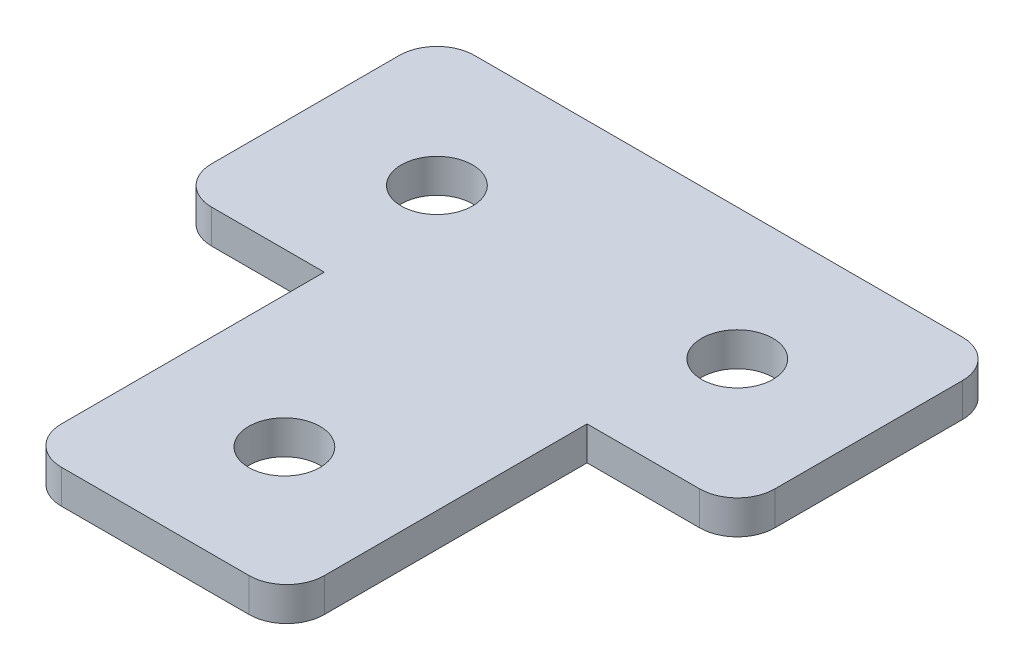
ISO-10303-21;
HEADER;
FILE_DESCRIPTION(('STEP AP214'),'2;1');
FILE_NAME('part.step','',(''),(''),'','','');
FILE_SCHEMA(('AUTOMOTIVE_DESIGN { 1 0 10303 214 1 1 1 1 }'));
ENDSEC;
DATA;
#1=APPLICATION_CONTEXT('core data for automotive mechanical design processes');
#2=APPLICATION_PROTOCOL_DEFINITION('international standard','automotive_design',2000,#1);
#3=PRODUCT_CONTEXT('',#1,'mechanical');
#4=PRODUCT('Part','Part','',(#3));
#5=PRODUCT_RELATED_PRODUCT_CATEGORY('part','',(#4));
#6=PRODUCT_DEFINITION_FORMATION('','',#4);
#7=PRODUCT_DEFINITION_CONTEXT('part definition',#1,'design');
#8=PRODUCT_DEFINITION('design','',#6,#7);
#9=PRODUCT_DEFINITION_SHAPE('','',#8);
#10=(LENGTH_UNIT() NAMED_UNIT(*) SI_UNIT(.MILLI.,.METRE.));
#11=(NAMED_UNIT(*) PLANE_ANGLE_UNIT() SI_UNIT($,.RADIAN.));
#12=(NAMED_UNIT(*) SI_UNIT($,.STERADIAN.) SOLID_ANGLE_UNIT());
#13=UNCERTAINTY_MEASURE_WITH_UNIT(LENGTH_MEASURE(1.E-05),#10,'distance_accuracy_value','');
#14=(GEOMETRIC_REPRESENTATION_CONTEXT(3) GLOBAL_UNCERTAINTY_ASSIGNED_CONTEXT((#13)) GLOBAL_UNIT_ASSIGNED_CONTEXT((#10,
#11,#12)) REPRESENTATION_CONTEXT('',''));
#15=CARTESIAN_POINT('',(0.,0.,0.));
#16=DIRECTION('',(0.,0.,1.));
#17=DIRECTION('',(1.,0.,0.));
#18=AXIS2_PLACEMENT_3D('',#15,#16,#17);
#19=CARTESIAN_POINT('',(0.,1.8,0.));
#20=DIRECTION('',(0.,1.,0.));
#21=DIRECTION('',(0.,0.,1.));
#22=AXIS2_PLACEMENT_3D('',#19,#20,#21);
#23=PLANE('',#22);
#24=CARTESIAN_POINT('',(23.,1.8,7.));
#25=DIRECTION('',(0.,1.,0.));
#26=DIRECTION('',(0.,0.,1.));
#27=AXIS2_PLACEMENT_3D('',#24,#25,#26);
#28=CIRCLE('',#27,1.9);
#29=CARTESIAN_POINT('',(23.,1.8,8.9));
#30=VERTEX_POINT('',#29);
#31=EDGE_CURVE('E336',#30,#30,#28,.T.);
#32=ORIENTED_EDGE('',*,*,#31,.F.);
#33=EDGE_LOOP('',(#32));
#34=FACE_BOUND('',#33,.T.);
#35=DIRECTION('',(-1.,0.,0.));
#36=VECTOR('',#35,1.);
#37=CARTESIAN_POINT('',(0.,1.8,0.));
#38=LINE('',#37,#36);
#39=CARTESIAN_POINT('',(28.,1.8,0.));
#40=VERTEX_POINT('',#39);
#41=CARTESIAN_POINT('',(2.,1.8,0.));
#42=VERTEX_POINT('',#41);
#43=EDGE_CURVE('E177',#40,#42,#38,.T.);
#44=ORIENTED_EDGE('',*,*,#43,.T.);
#45=CARTESIAN_POINT('',(2.,1.8,2.));
#46=DIRECTION('',(0.,1.,0.));
#47=DIRECTION('',(0.,0.,1.));
#48=AXIS2_PLACEMENT_3D('',#45,#46,#47);
#49=CIRCLE('',#48,2.);
#50=CARTESIAN_POINT('',(0.,1.8,2.));
#51=VERTEX_POINT('',#50);
#52=EDGE_CURVE('E230',#42,#51,#49,.T.);
#53=ORIENTED_EDGE('',*,*,#52,.T.);
#54=DIRECTION('',(0.,0.,1.));
#55=VECTOR('',#54,1.);
#56=CARTESIAN_POINT('',(0.,1.8,0.));
#57=LINE('',#56,#55);
#58=CARTESIAN_POINT('',(0.,1.8,12.));
#59=VERTEX_POINT('',#58);
#60=EDGE_CURVE('E150',#51,#59,#57,.T.);
#61=ORIENTED_EDGE('',*,*,#60,.T.);
#62=CARTESIAN_POINT('',(2.,1.8,12.));
#63=DIRECTION('',(0.,1.,0.));
#64=DIRECTION('',(0.,0.,1.));
#65=AXIS2_PLACEMENT_3D('',#62,#63,#64);
#66=CIRCLE('',#65,2.);
#67=CARTESIAN_POINT('',(2.,1.8,14.));
#68=VERTEX_POINT('',#67);
#69=EDGE_CURVE('E146',#59,#68,#66,.T.);
#70=ORIENTED_EDGE('',*,*,#69,.T.);
#71=DIRECTION('',(1.,0.,0.));
#72=VECTOR('',#71,1.);
#73=CARTESIAN_POINT('',(0.,1.8,14.));
#74=LINE('',#73,#72);
#75=CARTESIAN_POINT('',(8.,1.8,14.));
#76=VERTEX_POINT('',#75);
#77=EDGE_CURVE('E137',#68,#76,#74,.T.);
#78=ORIENTED_EDGE('',*,*,#77,.T.);
#79=DIRECTION('',(0.,0.,1.));
#80=VECTOR('',#79,1.);
#81=CARTESIAN_POINT('',(8.,1.8,14.));
#82=LINE('',#81,#80);
#83=CARTESIAN_POINT('',(8.,1.8,28.));
#84=VERTEX_POINT('',#83);
#85=EDGE_CURVE('E142',#76,#84,#82,.T.);
#86=ORIENTED_EDGE('',*,*,#85,.T.);
#87=CARTESIAN_POINT('',(10.,1.8,28.));
#88=DIRECTION('',(0.,1.,0.));
#89=DIRECTION('',(0.,0.,1.));
#90=AXIS2_PLACEMENT_3D('',#87,#88,#89);
#91=CIRCLE('',#90,2.);
#92=CARTESIAN_POINT('',(10.,1.8,30.));
#93=VERTEX_POINT('',#92);
#94=EDGE_CURVE('E224',#84,#93,#91,.T.);
#95=ORIENTED_EDGE('',*,*,#94,.T.);
#96=DIRECTION('',(1.,0.,0.));
#97=VECTOR('',#96,1.);
#98=CARTESIAN_POINT('',(8.,1.8,30.));
#99=LINE('',#98,#97);
#100=CARTESIAN_POINT('',(20.,1.8,30.));
#101=VERTEX_POINT('',#100);
#102=EDGE_CURVE('E165',#93,#101,#99,.T.);
#103=ORIENTED_EDGE('',*,*,#102,.T.);
#104=CARTESIAN_POINT('',(20.,1.8,28.));
#105=DIRECTION('',(0.,1.,0.));
#106=DIRECTION('',(0.,0.,1.));
#107=AXIS2_PLACEMENT_3D('',#104,#105,#106);
#108=CIRCLE('',#107,2.);
#109=CARTESIAN_POINT('',(22.,1.8,28.));
#110=VERTEX_POINT('',#109);
#111=EDGE_CURVE('E222',#101,#110,#108,.T.);
#112=ORIENTED_EDGE('',*,*,#111,.T.);
#113=DIRECTION('',(0.,0.,-1.));
#114=VECTOR('',#113,1.);
#115=CARTESIAN_POINT('',(22.,1.8,14.));
#116=LINE('',#115,#114);
#117=CARTESIAN_POINT('',(22.,1.8,14.));
#118=VERTEX_POINT('',#117);
#119=EDGE_CURVE('E168',#110,#118,#116,.T.);
#120=ORIENTED_EDGE('',*,*,#119,.T.);
#121=DIRECTION('',(1.,0.,0.));
#122=VECTOR('',#121,1.);
#123=CARTESIAN_POINT('',(22.,1.8,14.));
#124=LINE('',#123,#122);
#125=CARTESIAN_POINT('',(28.,1.8,14.));
#126=VERTEX_POINT('',#125);
#127=EDGE_CURVE('E173',#118,#126,#124,.T.);
#128=ORIENTED_EDGE('',*,*,#127,.T.);
#129=CARTESIAN_POINT('',(28.,1.8,12.));
#130=DIRECTION('',(0.,1.,0.));
#131=DIRECTION('',(0.,0.,1.));
#132=AXIS2_PLACEMENT_3D('',#129,#130,#131);
#133=CIRCLE('',#132,2.);
#134=CARTESIAN_POINT('',(30.,1.8,12.));
#135=VERTEX_POINT('',#134);
#136=EDGE_CURVE('E57',#126,#135,#133,.T.);
#137=ORIENTED_EDGE('',*,*,#136,.T.);
#138=DIRECTION('',(0.,0.,-1.));
#139=VECTOR('',#138,1.);
#140=CARTESIAN_POINT('',(30.,1.8,0.));
#141=LINE('',#140,#139);
#142=CARTESIAN_POINT('',(30.,1.8,2.));
#143=VERTEX_POINT('',#142);
#144=EDGE_CURVE('E175',#135,#143,#141,.T.);
#145=ORIENTED_EDGE('',*,*,#144,.T.);
#146=CARTESIAN_POINT('',(28.,1.8,2.));
#147=DIRECTION('',(0.,1.,0.));
#148=DIRECTION('',(0.,0.,1.));
#149=AXIS2_PLACEMENT_3D('',#146,#147,#148);
#150=CIRCLE('',#149,2.);
#151=EDGE_CURVE('E227',#143,#40,#150,.T.);
#152=ORIENTED_EDGE('',*,*,#151,.T.);
#153=EDGE_LOOP('',(#44,#53,#61,#70,#78,#86,#95,#103,#112,#120,#128,#137,#145,#152));
#154=FACE_BOUND('',#153,.T.);
#155=CARTESIAN_POINT('',(7.,1.8,7.));
#156=DIRECTION('',(0.,1.,0.));
#157=DIRECTION('',(0.,0.,1.));
#158=AXIS2_PLACEMENT_3D('',#155,#156,#157);
#159=CIRCLE('',#158,1.9);
#160=CARTESIAN_POINT('',(7.,1.8,8.9));
#161=VERTEX_POINT('',#160);
#162=EDGE_CURVE('E182',#161,#161,#159,.T.);
#163=ORIENTED_EDGE('',*,*,#162,.F.);
#164=EDGE_LOOP('',(#163));
#165=FACE_BOUND('',#164,.T.);
#166=CARTESIAN_POINT('',(15.,1.8,23.1245154965971));
#167=DIRECTION('',(0.,1.,0.));
#168=DIRECTION('',(0.,0.,1.));
#169=AXIS2_PLACEMENT_3D('',#166,#167,#168);
#170=CIRCLE('',#169,1.9);
#171=CARTESIAN_POINT('',(15.,1.8,25.0245154965971));
#172=VERTEX_POINT('',#171);
#173=EDGE_CURVE('E342',#172,#172,#170,.T.);
#174=ORIENTED_EDGE('',*,*,#173,.F.);
#175=EDGE_LOOP('',(#174));
#176=FACE_BOUND('',#175,.T.);
#177=ADVANCED_FACE('F35',(#34,#154,#165,#176),#23,.T.);
#178=CARTESIAN_POINT('',(0.,0.,0.));
#179=DIRECTION('',(0.,1.,0.));
#180=DIRECTION('',(0.,0.,1.));
#181=AXIS2_PLACEMENT_3D('',#178,#179,#180);
#182=PLANE('',#181);
#183=DIRECTION('',(0.,0.,1.));
#184=VECTOR('',#183,1.);
#185=CARTESIAN_POINT('',(0.,0.,0.));
#186=LINE('',#185,#184);
#187=CARTESIAN_POINT('',(0.,0.,2.));
#188=VERTEX_POINT('',#187);
#189=CARTESIAN_POINT('',(0.,0.,12.));
#190=VERTEX_POINT('',#189);
#191=EDGE_CURVE('E179',#188,#190,#186,.T.);
#192=ORIENTED_EDGE('',*,*,#191,.F.);
#193=CARTESIAN_POINT('',(2.,0.,2.));
#194=DIRECTION('',(0.,1.,0.));
#195=DIRECTION('',(0.,0.,1.));
#196=AXIS2_PLACEMENT_3D('',#193,#194,#195);
#197=CIRCLE('',#196,2.);
#198=CARTESIAN_POINT('',(2.,0.,0.));
#199=VERTEX_POINT('',#198);
#200=EDGE_CURVE('E215',#188,#199,#197,.F.);
#201=ORIENTED_EDGE('',*,*,#200,.T.);
#202=DIRECTION('',(-1.,0.,0.));
#203=VECTOR('',#202,1.);
#204=CARTESIAN_POINT('',(0.,0.,0.));
#205=LINE('',#204,#203);
#206=CARTESIAN_POINT('',(28.,0.,0.));
#207=VERTEX_POINT('',#206);
#208=EDGE_CURVE('E196',#207,#199,#205,.T.);
#209=ORIENTED_EDGE('',*,*,#208,.F.);
#210=CARTESIAN_POINT('',(28.,0.,2.));
#211=DIRECTION('',(0.,1.,0.));
#212=DIRECTION('',(0.,0.,1.));
#213=AXIS2_PLACEMENT_3D('',#210,#211,#212);
#214=CIRCLE('',#213,2.);
#215=CARTESIAN_POINT('',(30.,0.,2.));
#216=VERTEX_POINT('',#215);
#217=EDGE_CURVE('E211',#207,#216,#214,.F.);
#218=ORIENTED_EDGE('',*,*,#217,.T.);
#219=DIRECTION('',(0.,0.,-1.));
#220=VECTOR('',#219,1.);
#221=CARTESIAN_POINT('',(30.,0.,0.));
#222=LINE('',#221,#220);
#223=CARTESIAN_POINT('',(30.,0.,12.));
#224=VERTEX_POINT('',#223);
#225=EDGE_CURVE('E194',#224,#216,#222,.T.);
#226=ORIENTED_EDGE('',*,*,#225,.F.);
#227=CARTESIAN_POINT('',(28.,0.,12.));
#228=DIRECTION('',(0.,1.,0.));
#229=DIRECTION('',(0.,0.,1.));
#230=AXIS2_PLACEMENT_3D('',#227,#228,#229);
#231=CIRCLE('',#230,2.);
#232=CARTESIAN_POINT('',(28.,0.,14.));
#233=VERTEX_POINT('',#232);
#234=EDGE_CURVE('E209',#224,#233,#231,.F.);
#235=ORIENTED_EDGE('',*,*,#234,.T.);
#236=DIRECTION('',(1.,0.,0.));
#237=VECTOR('',#236,1.);
#238=CARTESIAN_POINT('',(22.,0.,14.));
#239=LINE('',#238,#237);
#240=CARTESIAN_POINT('',(22.,0.,14.));
#241=VERTEX_POINT('',#240);
#242=EDGE_CURVE('E191',#241,#233,#239,.T.);
#243=ORIENTED_EDGE('',*,*,#242,.F.);
#244=DIRECTION('',(0.,0.,-1.));
#245=VECTOR('',#244,1.);
#246=CARTESIAN_POINT('',(22.,0.,14.));
#247=LINE('',#246,#245);
#248=CARTESIAN_POINT('',(22.,0.,28.));
#249=VERTEX_POINT('',#248);
#250=EDGE_CURVE('E189',#249,#241,#247,.T.);
#251=ORIENTED_EDGE('',*,*,#250,.F.);
#252=CARTESIAN_POINT('',(20.,0.,28.));
#253=DIRECTION('',(0.,1.,0.));
#254=DIRECTION('',(0.,0.,1.));
#255=AXIS2_PLACEMENT_3D('',#252,#253,#254);
#256=CIRCLE('',#255,2.);
#257=CARTESIAN_POINT('',(20.,0.,30.));
#258=VERTEX_POINT('',#257);
#259=EDGE_CURVE('E205',#249,#258,#256,.F.);
#260=ORIENTED_EDGE('',*,*,#259,.T.);
#261=DIRECTION('',(1.,0.,0.));
#262=VECTOR('',#261,1.);
#263=CARTESIAN_POINT('',(8.,0.,30.));
#264=LINE('',#263,#262);
#265=CARTESIAN_POINT('',(10.,0.,30.));
#266=VERTEX_POINT('',#265);
#267=EDGE_CURVE('E186',#266,#258,#264,.T.);
#268=ORIENTED_EDGE('',*,*,#267,.F.);
#269=CARTESIAN_POINT('',(10.,0.,28.));
#270=DIRECTION('',(0.,1.,0.));
#271=DIRECTION('',(0.,0.,1.));
#272=AXIS2_PLACEMENT_3D('',#269,#270,#271);
#273=CIRCLE('',#272,2.);
#274=CARTESIAN_POINT('',(8.,0.,28.));
#275=VERTEX_POINT('',#274);
#276=EDGE_CURVE('E207',#266,#275,#273,.F.);
#277=ORIENTED_EDGE('',*,*,#276,.T.);
#278=DIRECTION('',(0.,0.,1.));
#279=VECTOR('',#278,1.);
#280=CARTESIAN_POINT('',(8.,0.,14.));
#281=LINE('',#280,#279);
#282=CARTESIAN_POINT('',(8.,0.,14.));
#283=VERTEX_POINT('',#282);
#284=EDGE_CURVE('E184',#283,#275,#281,.T.);
#285=ORIENTED_EDGE('',*,*,#284,.F.);
#286=DIRECTION('',(1.,0.,0.));
#287=VECTOR('',#286,1.);
#288=CARTESIAN_POINT('',(0.,0.,14.));
#289=LINE('',#288,#287);
#290=CARTESIAN_POINT('',(2.,0.,14.));
#291=VERTEX_POINT('',#290);
#292=EDGE_CURVE('E156',#291,#283,#289,.T.);
#293=ORIENTED_EDGE('',*,*,#292,.F.);
#294=CARTESIAN_POINT('',(2.,0.,12.));
#295=DIRECTION('',(0.,1.,0.));
#296=DIRECTION('',(0.,0.,1.));
#297=AXIS2_PLACEMENT_3D('',#294,#295,#296);
#298=CIRCLE('',#297,2.);
#299=EDGE_CURVE('E213',#291,#190,#298,.F.);
#300=ORIENTED_EDGE('',*,*,#299,.T.);
#301=EDGE_LOOP('',(#192,#201,#209,#218,#226,#235,#243,#251,#260,#268,#277,#285,#293,#300));
#302=FACE_BOUND('',#301,.T.);
#303=CARTESIAN_POINT('',(7.,0.,7.));
#304=DIRECTION('',(0.,1.,0.));
#305=DIRECTION('',(0.,0.,1.));
#306=AXIS2_PLACEMENT_3D('',#303,#304,#305);
#307=CIRCLE('',#306,1.9);
#308=CARTESIAN_POINT('',(7.,0.,8.9));
#309=VERTEX_POINT('',#308);
#310=EDGE_CURVE('E333',#309,#309,#307,.T.);
#311=ORIENTED_EDGE('',*,*,#310,.T.);
#312=EDGE_LOOP('',(#311));
#313=FACE_BOUND('',#312,.T.);
#314=CARTESIAN_POINT('',(23.,0.,7.));
#315=DIRECTION('',(0.,1.,0.));
#316=DIRECTION('',(0.,0.,1.));
#317=AXIS2_PLACEMENT_3D('',#314,#315,#316);
#318=CIRCLE('',#317,1.9);
#319=CARTESIAN_POINT('',(23.,0.,8.9));
#320=VERTEX_POINT('',#319);
#321=EDGE_CURVE('E339',#320,#320,#318,.T.);
#322=ORIENTED_EDGE('',*,*,#321,.T.);
#323=EDGE_LOOP('',(#322));
#324=FACE_BOUND('',#323,.T.);
#325=CARTESIAN_POINT('',(15.,0.,23.1245154965971));
#326=DIRECTION('',(0.,1.,0.));
#327=DIRECTION('',(0.,0.,1.));
#328=AXIS2_PLACEMENT_3D('',#325,#326,#327);
#329=CIRCLE('',#328,1.9);
#330=CARTESIAN_POINT('',(15.,0.,25.0245154965971));
#331=VERTEX_POINT('',#330);
#332=EDGE_CURVE('E345',#331,#331,#329,.T.);
#333=ORIENTED_EDGE('',*,*,#332,.T.);
#334=EDGE_LOOP('',(#333));
#335=FACE_BOUND('',#334,.T.);
#336=ADVANCED_FACE('F253',(#302,#313,#324,#335),#182,.F.);
#337=CARTESIAN_POINT('',(0.,1.8,0.));
#338=DIRECTION('',(1.,0.,0.));
#339=DIRECTION('',(0.,0.,-1.));
#340=AXIS2_PLACEMENT_3D('',#337,#338,#339);
#341=PLANE('',#340);
#342=ORIENTED_EDGE('',*,*,#60,.F.);
#343=DIRECTION('',(0.,-1.,0.));
#344=VECTOR('',#343,1.);
#345=CARTESIAN_POINT('',(0.,1.8,2.));
#346=LINE('',#345,#344);
#347=EDGE_CURVE('E202',#51,#188,#346,.T.);
#348=ORIENTED_EDGE('',*,*,#347,.T.);
#349=ORIENTED_EDGE('',*,*,#191,.T.);
#350=DIRECTION('',(0.,-1.,0.));
#351=VECTOR('',#350,1.);
#352=CARTESIAN_POINT('',(0.,1.8,12.));
#353=LINE('',#352,#351);
#354=EDGE_CURVE('E160',#190,#59,#353,.F.);
#355=ORIENTED_EDGE('',*,*,#354,.T.);
#356=EDGE_LOOP('',(#342,#348,#349,#355));
#357=FACE_BOUND('',#356,.T.);
#358=ADVANCED_FACE('F281',(#357),#341,.F.);
#359=CARTESIAN_POINT('',(0.,1.8,14.));
#360=DIRECTION('',(0.,0.,-1.));
#361=DIRECTION('',(-1.,0.,0.));
#362=AXIS2_PLACEMENT_3D('',#359,#360,#361);
#363=PLANE('',#362);
#364=ORIENTED_EDGE('',*,*,#77,.F.);
#365=DIRECTION('',(0.,-1.,0.));
#366=VECTOR('',#365,1.);
#367=CARTESIAN_POINT('',(2.,1.8,14.));
#368=LINE('',#367,#366);
#369=EDGE_CURVE('E232',#68,#291,#368,.T.);
#370=ORIENTED_EDGE('',*,*,#369,.T.);
#371=ORIENTED_EDGE('',*,*,#292,.T.);
#372=DIRECTION('',(0.,-1.,0.));
#373=VECTOR('',#372,1.);
#374=CARTESIAN_POINT('',(8.,1.8,14.));
#375=LINE('',#374,#373);
#376=EDGE_CURVE('E153',#76,#283,#375,.T.);
#377=ORIENTED_EDGE('',*,*,#376,.F.);
#378=EDGE_LOOP('',(#364,#370,#371,#377));
#379=FACE_BOUND('',#378,.T.);
#380=ADVANCED_FACE('F154',(#379),#363,.F.);
#381=CARTESIAN_POINT('',(8.,1.8,14.));
#382=DIRECTION('',(1.,0.,0.));
#383=DIRECTION('',(0.,0.,-1.));
#384=AXIS2_PLACEMENT_3D('',#381,#382,#383);
#385=PLANE('',#384);
#386=ORIENTED_EDGE('',*,*,#284,.T.);
#387=DIRECTION('',(0.,-1.,0.));
#388=VECTOR('',#387,1.);
#389=CARTESIAN_POINT('',(8.,1.8,28.));
#390=LINE('',#389,#388);
#391=EDGE_CURVE('E43',#275,#84,#390,.F.);
#392=ORIENTED_EDGE('',*,*,#391,.T.);
#393=ORIENTED_EDGE('',*,*,#85,.F.);
#394=ORIENTED_EDGE('',*,*,#376,.T.);
#395=EDGE_LOOP('',(#386,#392,#393,#394));
#396=FACE_BOUND('',#395,.T.);
#397=ADVANCED_FACE('F163',(#396),#385,.F.);
#398=CARTESIAN_POINT('',(8.,1.8,30.));
#399=DIRECTION('',(0.,0.,-1.));
#400=DIRECTION('',(-1.,0.,0.));
#401=AXIS2_PLACEMENT_3D('',#398,#399,#400);
#402=PLANE('',#401);
#403=ORIENTED_EDGE('',*,*,#102,.F.);
#404=DIRECTION('',(0.,-1.,0.));
#405=VECTOR('',#404,1.);
#406=CARTESIAN_POINT('',(10.,1.8,30.));
#407=LINE('',#406,#405);
#408=EDGE_CURVE('E242',#93,#266,#407,.T.);
#409=ORIENTED_EDGE('',*,*,#408,.T.);
#410=ORIENTED_EDGE('',*,*,#267,.T.);
#411=DIRECTION('',(0.,-1.,0.));
#412=VECTOR('',#411,1.);
#413=CARTESIAN_POINT('',(20.,1.8,30.));
#414=LINE('',#413,#412);
#415=EDGE_CURVE('E240',#258,#101,#414,.F.);
#416=ORIENTED_EDGE('',*,*,#415,.T.);
#417=EDGE_LOOP('',(#403,#409,#410,#416));
#418=FACE_BOUND('',#417,.T.);
#419=ADVANCED_FACE('F248',(#418),#402,.F.);
#420=CARTESIAN_POINT('',(22.,1.8,14.));
#421=DIRECTION('',(-1.,0.,0.));
#422=DIRECTION('',(0.,0.,1.));
#423=AXIS2_PLACEMENT_3D('',#420,#421,#422);
#424=PLANE('',#423);
#425=ORIENTED_EDGE('',*,*,#119,.F.);
#426=DIRECTION('',(0.,-1.,0.));
#427=VECTOR('',#426,1.);
#428=CARTESIAN_POINT('',(22.,1.8,28.));
#429=LINE('',#428,#427);
#430=EDGE_CURVE('E11',#110,#249,#429,.T.);
#431=ORIENTED_EDGE('',*,*,#430,.T.);
#432=ORIENTED_EDGE('',*,*,#250,.T.);
#433=DIRECTION('',(0.,-1.,0.));
#434=VECTOR('',#433,1.);
#435=CARTESIAN_POINT('',(22.,1.8,14.));
#436=LINE('',#435,#434);
#437=EDGE_CURVE('E161',#118,#241,#436,.T.);
#438=ORIENTED_EDGE('',*,*,#437,.F.);
#439=EDGE_LOOP('',(#425,#431,#432,#438));
#440=FACE_BOUND('',#439,.T.);
#441=ADVANCED_FACE('F262',(#440),#424,.F.);
#442=CARTESIAN_POINT('',(22.,1.8,14.));
#443=DIRECTION('',(0.,0.,-1.));
#444=DIRECTION('',(-1.,0.,0.));
#445=AXIS2_PLACEMENT_3D('',#442,#443,#444);
#446=PLANE('',#445);
#447=ORIENTED_EDGE('',*,*,#242,.T.);
#448=DIRECTION('',(0.,-1.,0.));
#449=VECTOR('',#448,1.);
#450=CARTESIAN_POINT('',(28.,1.8,14.));
#451=LINE('',#450,#449);
#452=EDGE_CURVE('E238',#233,#126,#451,.F.);
#453=ORIENTED_EDGE('',*,*,#452,.T.);
#454=ORIENTED_EDGE('',*,*,#127,.F.);
#455=ORIENTED_EDGE('',*,*,#437,.T.);
#456=EDGE_LOOP('',(#447,#453,#454,#455));
#457=FACE_BOUND('',#456,.T.);
#458=ADVANCED_FACE('F295',(#457),#446,.F.);
#459=CARTESIAN_POINT('',(30.,1.8,0.));
#460=DIRECTION('',(-1.,0.,0.));
#461=DIRECTION('',(0.,0.,1.));
#462=AXIS2_PLACEMENT_3D('',#459,#460,#461);
#463=PLANE('',#462);
#464=ORIENTED_EDGE('',*,*,#225,.T.);
#465=DIRECTION('',(0.,-1.,0.));
#466=VECTOR('',#465,1.);
#467=CARTESIAN_POINT('',(30.,1.8,2.));
#468=LINE('',#467,#466);
#469=EDGE_CURVE('E50',#216,#143,#468,.F.);
#470=ORIENTED_EDGE('',*,*,#469,.T.);
#471=ORIENTED_EDGE('',*,*,#144,.F.);
#472=DIRECTION('',(0.,-1.,0.));
#473=VECTOR('',#472,1.);
#474=CARTESIAN_POINT('',(30.,1.8,12.));
#475=LINE('',#474,#473);
#476=EDGE_CURVE('E234',#135,#224,#475,.T.);
#477=ORIENTED_EDGE('',*,*,#476,.T.);
#478=EDGE_LOOP('',(#464,#470,#471,#477));
#479=FACE_BOUND('',#478,.T.);
#480=ADVANCED_FACE('F291',(#479),#463,.F.);
#481=CARTESIAN_POINT('',(0.,1.8,0.));
#482=DIRECTION('',(0.,0.,1.));
#483=DIRECTION('',(1.,0.,0.));
#484=AXIS2_PLACEMENT_3D('',#481,#482,#483);
#485=PLANE('',#484);
#486=ORIENTED_EDGE('',*,*,#208,.T.);
#487=DIRECTION('',(0.,-1.,0.));
#488=VECTOR('',#487,1.);
#489=CARTESIAN_POINT('',(2.,1.8,0.));
#490=LINE('',#489,#488);
#491=EDGE_CURVE('E220',#199,#42,#490,.F.);
#492=ORIENTED_EDGE('',*,*,#491,.T.);
#493=ORIENTED_EDGE('',*,*,#43,.F.);
#494=DIRECTION('',(0.,-1.,0.));
#495=VECTOR('',#494,1.);
#496=CARTESIAN_POINT('',(28.,1.8,0.));
#497=LINE('',#496,#495);
#498=EDGE_CURVE('E217',#40,#207,#497,.T.);
#499=ORIENTED_EDGE('',*,*,#498,.T.);
#500=EDGE_LOOP('',(#486,#492,#493,#499));
#501=FACE_BOUND('',#500,.T.);
#502=ADVANCED_FACE('F288',(#501),#485,.F.);
#503=CARTESIAN_POINT('',(7.,1.8,7.));
#504=DIRECTION('',(0.,-1.,0.));
#505=DIRECTION('',(0.,0.,-1.));
#506=AXIS2_PLACEMENT_3D('',#503,#504,#505);
#507=CYLINDRICAL_SURFACE('',#506,1.9);
#508=ORIENTED_EDGE('',*,*,#162,.T.);
#509=EDGE_LOOP('',(#508));
#510=FACE_BOUND('',#509,.T.);
#511=ORIENTED_EDGE('',*,*,#310,.F.);
#512=EDGE_LOOP('',(#511));
#513=FACE_BOUND('',#512,.T.);
#514=ADVANCED_FACE('F285',(#510,#513),#507,.F.);
#515=CARTESIAN_POINT('',(23.,1.8,7.));
#516=DIRECTION('',(0.,-1.,0.));
#517=DIRECTION('',(0.,0.,-1.));
#518=AXIS2_PLACEMENT_3D('',#515,#516,#517);
#519=CYLINDRICAL_SURFACE('',#518,1.9);
#520=ORIENTED_EDGE('',*,*,#31,.T.);
#521=EDGE_LOOP('',(#520));
#522=FACE_BOUND('',#521,.T.);
#523=ORIENTED_EDGE('',*,*,#321,.F.);
#524=EDGE_LOOP('',(#523));
#525=FACE_BOUND('',#524,.T.);
#526=ADVANCED_FACE('F354',(#522,#525),#519,.F.);
#527=CARTESIAN_POINT('',(15.,1.8,23.1245154965971));
#528=DIRECTION('',(0.,-1.,0.));
#529=DIRECTION('',(0.,0.,-1.));
#530=AXIS2_PLACEMENT_3D('',#527,#528,#529);
#531=CYLINDRICAL_SURFACE('',#530,1.9);
#532=ORIENTED_EDGE('',*,*,#173,.T.);
#533=EDGE_LOOP('',(#532));
#534=FACE_BOUND('',#533,.T.);
#535=ORIENTED_EDGE('',*,*,#332,.F.);
#536=EDGE_LOOP('',(#535));
#537=FACE_BOUND('',#536,.T.);
#538=ADVANCED_FACE('F314',(#534,#537),#531,.F.);
#539=CARTESIAN_POINT('',(2.,1.8,2.));
#540=DIRECTION('',(0.,-1.,0.));
#541=DIRECTION('',(0.,0.,-1.));
#542=AXIS2_PLACEMENT_3D('',#539,#540,#541);
#543=CYLINDRICAL_SURFACE('',#542,2.);
#544=ORIENTED_EDGE('',*,*,#52,.F.);
#545=ORIENTED_EDGE('',*,*,#491,.F.);
#546=ORIENTED_EDGE('',*,*,#200,.F.);
#547=ORIENTED_EDGE('',*,*,#347,.F.);
#548=EDGE_LOOP('',(#544,#545,#546,#547));
#549=FACE_BOUND('',#548,.T.);
#550=ADVANCED_FACE('F310',(#549),#543,.T.);
#551=CARTESIAN_POINT('',(2.,1.8,12.));
#552=DIRECTION('',(0.,-1.,0.));
#553=DIRECTION('',(0.,0.,-1.));
#554=AXIS2_PLACEMENT_3D('',#551,#552,#553);
#555=CYLINDRICAL_SURFACE('',#554,2.);
#556=ORIENTED_EDGE('',*,*,#69,.F.);
#557=ORIENTED_EDGE('',*,*,#354,.F.);
#558=ORIENTED_EDGE('',*,*,#299,.F.);
#559=ORIENTED_EDGE('',*,*,#369,.F.);
#560=EDGE_LOOP('',(#556,#557,#558,#559));
#561=FACE_BOUND('',#560,.T.);
#562=ADVANCED_FACE('F313',(#561),#555,.T.);
#563=CARTESIAN_POINT('',(28.,1.8,2.));
#564=DIRECTION('',(0.,-1.,0.));
#565=DIRECTION('',(0.,0.,-1.));
#566=AXIS2_PLACEMENT_3D('',#563,#564,#565);
#567=CYLINDRICAL_SURFACE('',#566,2.);
#568=ORIENTED_EDGE('',*,*,#151,.F.);
#569=ORIENTED_EDGE('',*,*,#469,.F.);
#570=ORIENTED_EDGE('',*,*,#217,.F.);
#571=ORIENTED_EDGE('',*,*,#498,.F.);
#572=EDGE_LOOP('',(#568,#569,#570,#571));
#573=FACE_BOUND('',#572,.T.);
#574=ADVANCED_FACE('F272',(#573),#567,.T.);
#575=CARTESIAN_POINT('',(28.,1.8,12.));
#576=DIRECTION('',(0.,-1.,0.));
#577=DIRECTION('',(0.,0.,-1.));
#578=AXIS2_PLACEMENT_3D('',#575,#576,#577);
#579=CYLINDRICAL_SURFACE('',#578,2.);
#580=ORIENTED_EDGE('',*,*,#136,.F.);
#581=ORIENTED_EDGE('',*,*,#452,.F.);
#582=ORIENTED_EDGE('',*,*,#234,.F.);
#583=ORIENTED_EDGE('',*,*,#476,.F.);
#584=EDGE_LOOP('',(#580,#581,#582,#583));
#585=FACE_BOUND('',#584,.T.);
#586=ADVANCED_FACE('F267',(#585),#579,.T.);
#587=CARTESIAN_POINT('',(10.,1.8,28.));
#588=DIRECTION('',(0.,-1.,0.));
#589=DIRECTION('',(0.,0.,-1.));
#590=AXIS2_PLACEMENT_3D('',#587,#588,#589);
#591=CYLINDRICAL_SURFACE('',#590,2.);
#592=ORIENTED_EDGE('',*,*,#94,.F.);
#593=ORIENTED_EDGE('',*,*,#391,.F.);
#594=ORIENTED_EDGE('',*,*,#276,.F.);
#595=ORIENTED_EDGE('',*,*,#408,.F.);
#596=EDGE_LOOP('',(#592,#593,#594,#595));
#597=FACE_BOUND('',#596,.T.);
#598=ADVANCED_FACE('F265',(#597),#591,.T.);
#599=CARTESIAN_POINT('',(20.,1.8,28.));
#600=DIRECTION('',(0.,-1.,0.));
#601=DIRECTION('',(0.,0.,-1.));
#602=AXIS2_PLACEMENT_3D('',#599,#600,#601);
#603=CYLINDRICAL_SURFACE('',#602,2.);
#604=ORIENTED_EDGE('',*,*,#111,.F.);
#605=ORIENTED_EDGE('',*,*,#415,.F.);
#606=ORIENTED_EDGE('',*,*,#259,.F.);
#607=ORIENTED_EDGE('',*,*,#430,.F.);
#608=EDGE_LOOP('',(#604,#605,#606,#607));
#609=FACE_BOUND('',#608,.T.);
#610=ADVANCED_FACE('F37',(#609),#603,.T.);
#611=CLOSED_SHELL('',(#177,#336,#358,#380,#397,#419,#441,#458,#480,#502,#514,#526,#538,#550,
#562,#574,#586,#598,#610));
#612=MANIFOLD_SOLID_BREP('B2',#611);
#613=ADVANCED_BREP_SHAPE_REPRESENTATION('',(#18,#612),#14);
#614=SHAPE_DEFINITION_REPRESENTATION(#9,#613);
ENDSEC;
END-ISO-10303-21;
